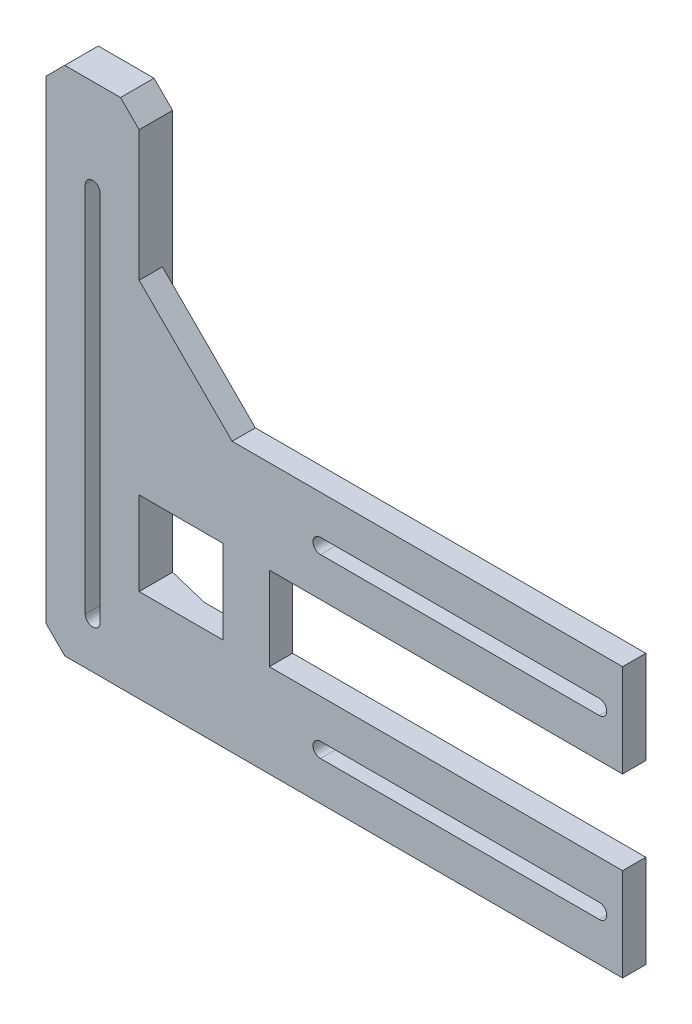
ISO-10303-21;
HEADER;
FILE_DESCRIPTION(('STEP AP214'),'2;1');
FILE_NAME('part.step','',(''),(''),'','','');
FILE_SCHEMA(('AUTOMOTIVE_DESIGN { 1 0 10303 214 1 1 1 1 }'));
ENDSEC;
DATA;
#1=APPLICATION_CONTEXT('core data for automotive mechanical design processes');
#2=APPLICATION_PROTOCOL_DEFINITION('international standard','automotive_design',2000,#1);
#3=PRODUCT_CONTEXT('',#1,'mechanical');
#4=PRODUCT('Part','Part','',(#3));
#5=PRODUCT_RELATED_PRODUCT_CATEGORY('part','',(#4));
#6=PRODUCT_DEFINITION_FORMATION('','',#4);
#7=PRODUCT_DEFINITION_CONTEXT('part definition',#1,'design');
#8=PRODUCT_DEFINITION('design','',#6,#7);
#9=PRODUCT_DEFINITION_SHAPE('','',#8);
#10=(LENGTH_UNIT() NAMED_UNIT(*) SI_UNIT(.MILLI.,.METRE.));
#11=(NAMED_UNIT(*) PLANE_ANGLE_UNIT() SI_UNIT($,.RADIAN.));
#12=(NAMED_UNIT(*) SI_UNIT($,.STERADIAN.) SOLID_ANGLE_UNIT());
#13=UNCERTAINTY_MEASURE_WITH_UNIT(LENGTH_MEASURE(1.E-05),#10,'distance_accuracy_value','');
#14=(GEOMETRIC_REPRESENTATION_CONTEXT(3) GLOBAL_UNCERTAINTY_ASSIGNED_CONTEXT((#13)) GLOBAL_UNIT_ASSIGNED_CONTEXT((#10,
#11,#12)) REPRESENTATION_CONTEXT('',''));
#15=CARTESIAN_POINT('',(0.,0.,0.));
#16=DIRECTION('',(0.,0.,1.));
#17=DIRECTION('',(1.,0.,0.));
#18=AXIS2_PLACEMENT_3D('',#15,#16,#17);
#19=CARTESIAN_POINT('',(0.,22.3644669928919,5.));
#20=DIRECTION('',(0.,-1.,0.));
#21=DIRECTION('',(0.,0.,-1.));
#22=AXIS2_PLACEMENT_3D('',#19,#20,#21);
#23=PLANE('',#22);
#24=DIRECTION('',(-1.,0.,0.));
#25=VECTOR('',#24,1.);
#26=CARTESIAN_POINT('',(0.,22.3644669928919,0.));
#27=LINE('',#26,#25);
#28=CARTESIAN_POINT('',(-66.1345300278278,22.3644669928919,0.));
#29=VERTEX_POINT('',#28);
#30=CARTESIAN_POINT('',(-75.1345300278278,22.3644669928919,0.));
#31=VERTEX_POINT('',#30);
#32=EDGE_CURVE('E483',#29,#31,#27,.T.);
#33=ORIENTED_EDGE('',*,*,#32,.F.);
#34=DIRECTION('',(0.971399006496777,0.,0.23745309047699));
#35=VECTOR('',#34,1.);
#36=CARTESIAN_POINT('',(-75.1345300278278,22.3644669928919,-2.2));
#37=LINE('',#36,#35);
#38=CARTESIAN_POINT('',(-75.1345300278278,22.3644669928919,-2.2));
#39=VERTEX_POINT('',#38);
#40=EDGE_CURVE('E485',#39,#29,#37,.T.);
#41=ORIENTED_EDGE('',*,*,#40,.F.);
#42=DIRECTION('',(0.,0.,-1.));
#43=VECTOR('',#42,1.);
#44=CARTESIAN_POINT('',(-75.1345300278278,22.3644669928919,5.));
#45=LINE('',#44,#43);
#46=EDGE_CURVE('E480',#31,#39,#45,.T.);
#47=ORIENTED_EDGE('',*,*,#46,.F.);
#48=EDGE_LOOP('',(#33,#41,#47));
#49=FACE_BOUND('',#48,.T.);
#50=ADVANCED_FACE('F261',(#49),#23,.F.);
#51=CARTESIAN_POINT('',(-75.1345300278278,0.,5.));
#52=DIRECTION('',(-1.,0.,0.));
#53=DIRECTION('',(0.,0.,1.));
#54=AXIS2_PLACEMENT_3D('',#51,#52,#53);
#55=PLANE('',#54);
#56=DIRECTION('',(0.,0.,-1.));
#57=VECTOR('',#56,1.);
#58=CARTESIAN_POINT('',(-75.1345300278278,-15.6355330071088,5.));
#59=LINE('',#58,#57);
#60=CARTESIAN_POINT('',(-75.1345300278278,-15.6355330071088,5.));
#61=VERTEX_POINT('',#60);
#62=CARTESIAN_POINT('',(-75.1345300278278,-15.6355330071064,-2.2));
#63=VERTEX_POINT('',#62);
#64=EDGE_CURVE('E691',#61,#63,#59,.T.);
#65=ORIENTED_EDGE('',*,*,#64,.T.);
#66=DIRECTION('',(0.,-1.,0.));
#67=VECTOR('',#66,1.);
#68=CARTESIAN_POINT('',(-75.1345300278278,74.406088819695,-2.2));
#69=LINE('',#68,#67);
#70=CARTESIAN_POINT('',(-75.1345300278278,2.36446699289193,-2.2));
#71=VERTEX_POINT('',#70);
#72=EDGE_CURVE('E569',#71,#63,#69,.T.);
#73=ORIENTED_EDGE('',*,*,#72,.F.);
#74=DIRECTION('',(0.,0.,-1.));
#75=VECTOR('',#74,1.);
#76=CARTESIAN_POINT('',(-75.1345300278278,2.36446699289274,5.));
#77=LINE('',#76,#75);
#78=CARTESIAN_POINT('',(-75.1345300278278,2.36446699289274,5.));
#79=VERTEX_POINT('',#78);
#80=EDGE_CURVE('E698',#79,#71,#77,.T.);
#81=ORIENTED_EDGE('',*,*,#80,.F.);
#82=DIRECTION('',(0.,1.,0.));
#83=VECTOR('',#82,1.);
#84=CARTESIAN_POINT('',(-75.1345300278278,0.,5.));
#85=LINE('',#84,#83);
#86=EDGE_CURVE('E660',#61,#79,#85,.T.);
#87=ORIENTED_EDGE('',*,*,#86,.F.);
#88=EDGE_LOOP('',(#65,#73,#81,#87));
#89=FACE_BOUND('',#88,.T.);
#90=ADVANCED_FACE('F772',(#89),#55,.F.);
#91=CARTESIAN_POINT('',(-75.1345300278278,70.406088819695,-2.2));
#92=VERTEX_POINT('',#91);
#93=EDGE_CURVE('E565',#92,#39,#69,.T.);
#94=ORIENTED_EDGE('',*,*,#93,.F.);
#95=DIRECTION('',(0.,0.,1.));
#96=VECTOR('',#95,1.);
#97=CARTESIAN_POINT('',(-75.1345300278278,70.406088819695,5.));
#98=LINE('',#97,#96);
#99=CARTESIAN_POINT('',(-75.1345300278278,70.406088819695,5.));
#100=VERTEX_POINT('',#99);
#101=EDGE_CURVE('E13',#92,#100,#98,.T.);
#102=ORIENTED_EDGE('',*,*,#101,.T.);
#103=DIRECTION('',(0.,1.,0.));
#104=VECTOR('',#103,1.);
#105=CARTESIAN_POINT('',(-75.1345300278278,0.,5.));
#106=LINE('',#105,#104);
#107=CARTESIAN_POINT('',(-75.1345300278278,42.3644669928919,5.));
#108=VERTEX_POINT('',#107);
#109=EDGE_CURVE('E658',#108,#100,#106,.T.);
#110=ORIENTED_EDGE('',*,*,#109,.F.);
#111=DIRECTION('',(0.,0.,1.));
#112=VECTOR('',#111,1.);
#113=CARTESIAN_POINT('',(-75.1345300278278,42.3644669928919,5.));
#114=LINE('',#113,#112);
#115=CARTESIAN_POINT('',(-75.1345300278278,42.3644669928919,0.));
#116=VERTEX_POINT('',#115);
#117=EDGE_CURVE('E496',#108,#116,#114,.F.);
#118=ORIENTED_EDGE('',*,*,#117,.T.);
#119=DIRECTION('',(0.,1.,0.));
#120=VECTOR('',#119,1.);
#121=CARTESIAN_POINT('',(-75.1345300278278,0.,0.));
#122=LINE('',#121,#120);
#123=EDGE_CURVE('E493',#31,#116,#122,.T.);
#124=ORIENTED_EDGE('',*,*,#123,.F.);
#125=ORIENTED_EDGE('',*,*,#46,.T.);
#126=EDGE_LOOP('',(#94,#102,#110,#118,#124,#125));
#127=FACE_BOUND('',#126,.T.);
#128=ADVANCED_FACE('F494',(#127),#55,.F.);
#129=CARTESIAN_POINT('',(0.,0.,0.));
#130=DIRECTION('',(0.,0.,1.));
#131=DIRECTION('',(1.,0.,0.));
#132=AXIS2_PLACEMENT_3D('',#129,#130,#131);
#133=PLANE('',#132);
#134=CARTESIAN_POINT('',(23.8654699721722,-25.6355330071064,0.));
#135=DIRECTION('',(0.,0.,1.));
#136=DIRECTION('',(1.,0.,0.));
#137=AXIS2_PLACEMENT_3D('',#134,#135,#136);
#138=CIRCLE('',#137,1.6);
#139=CARTESIAN_POINT('',(23.8654699721722,-27.2355330071064,0.));
#140=VERTEX_POINT('',#139);
#141=CARTESIAN_POINT('',(23.8654699721722,-24.0355330071064,0.));
#142=VERTEX_POINT('',#141);
#143=EDGE_CURVE('E593',#140,#142,#138,.T.);
#144=ORIENTED_EDGE('',*,*,#143,.T.);
#145=DIRECTION('',(1.,0.,0.));
#146=VECTOR('',#145,1.);
#147=CARTESIAN_POINT('',(-36.1345300278278,-24.0355330071064,0.));
#148=LINE('',#147,#146);
#149=CARTESIAN_POINT('',(-36.1345300278278,-24.0355330071064,0.));
#150=VERTEX_POINT('',#149);
#151=EDGE_CURVE('E576',#150,#142,#148,.T.);
#152=ORIENTED_EDGE('',*,*,#151,.F.);
#153=CARTESIAN_POINT('',(-36.1345300278278,-25.6355330071064,0.));
#154=DIRECTION('',(0.,0.,1.));
#155=DIRECTION('',(1.,0.,0.));
#156=AXIS2_PLACEMENT_3D('',#153,#154,#155);
#157=CIRCLE('',#156,1.6);
#158=CARTESIAN_POINT('',(-36.1345300278278,-27.2355330071064,0.));
#159=VERTEX_POINT('',#158);
#160=EDGE_CURVE('E583',#150,#159,#157,.T.);
#161=ORIENTED_EDGE('',*,*,#160,.T.);
#162=DIRECTION('',(1.,0.,0.));
#163=VECTOR('',#162,1.);
#164=CARTESIAN_POINT('',(-36.1345300278278,-27.2355330071064,0.));
#165=LINE('',#164,#163);
#166=EDGE_CURVE('E574',#159,#140,#165,.T.);
#167=ORIENTED_EDGE('',*,*,#166,.T.);
#168=EDGE_LOOP('',(#144,#152,#161,#167));
#169=FACE_BOUND('',#168,.T.);
#170=DIRECTION('',(0.,-1.,0.));
#171=VECTOR('',#170,1.);
#172=CARTESIAN_POINT('',(-66.1345300278278,0.,0.));
#173=LINE('',#172,#171);
#174=CARTESIAN_POINT('',(-66.1345300278278,2.36446699289193,0.));
#175=VERTEX_POINT('',#174);
#176=EDGE_CURVE('E506',#175,#29,#173,.F.);
#177=ORIENTED_EDGE('',*,*,#176,.T.);
#178=ORIENTED_EDGE('',*,*,#32,.T.);
#179=ORIENTED_EDGE('',*,*,#123,.T.);
#180=DIRECTION('',(0.707106781186548,-0.707106781186548,0.));
#181=VECTOR('',#180,1.);
#182=CARTESIAN_POINT('',(-75.1345300278278,42.3644669928919,0.));
#183=LINE('',#182,#181);
#184=CARTESIAN_POINT('',(-55.1345300278278,22.3644669928919,0.));
#185=VERTEX_POINT('',#184);
#186=EDGE_CURVE('E510',#116,#185,#183,.T.);
#187=ORIENTED_EDGE('',*,*,#186,.T.);
#188=DIRECTION('',(-1.,0.,0.));
#189=VECTOR('',#188,1.);
#190=CARTESIAN_POINT('',(0.,22.3644669928919,0.));
#191=LINE('',#190,#189);
#192=CARTESIAN_POINT('',(28.8654699721715,22.3644669928919,0.));
#193=VERTEX_POINT('',#192);
#194=EDGE_CURVE('E682',#193,#185,#191,.T.);
#195=ORIENTED_EDGE('',*,*,#194,.F.);
#196=DIRECTION('',(0.,-1.,0.));
#197=VECTOR('',#196,1.);
#198=CARTESIAN_POINT('',(28.8654699721715,0.,0.));
#199=LINE('',#198,#197);
#200=CARTESIAN_POINT('',(28.8654699721715,2.36446699289274,0.));
#201=VERTEX_POINT('',#200);
#202=EDGE_CURVE('E679',#193,#201,#199,.T.);
#203=ORIENTED_EDGE('',*,*,#202,.T.);
#204=DIRECTION('',(-1.,0.,0.));
#205=VECTOR('',#204,1.);
#206=CARTESIAN_POINT('',(0.,2.36446699289274,0.));
#207=LINE('',#206,#205);
#208=CARTESIAN_POINT('',(-47.1345300278284,2.36446699289274,0.));
#209=VERTEX_POINT('',#208);
#210=EDGE_CURVE('E677',#201,#209,#207,.T.);
#211=ORIENTED_EDGE('',*,*,#210,.T.);
#212=DIRECTION('',(0.,1.,0.));
#213=VECTOR('',#212,1.);
#214=CARTESIAN_POINT('',(-47.1345300278284,0.,0.));
#215=LINE('',#214,#213);
#216=CARTESIAN_POINT('',(-47.1345300278284,-15.6355330071088,0.));
#217=VERTEX_POINT('',#216);
#218=EDGE_CURVE('E674',#217,#209,#215,.T.);
#219=ORIENTED_EDGE('',*,*,#218,.F.);
#220=DIRECTION('',(-1.,0.,0.));
#221=VECTOR('',#220,1.);
#222=CARTESIAN_POINT('',(0.,-15.6355330071088,0.));
#223=LINE('',#222,#221);
#224=CARTESIAN_POINT('',(28.8654699721722,-15.6355330071088,0.));
#225=VERTEX_POINT('',#224);
#226=EDGE_CURVE('E672',#225,#217,#223,.T.);
#227=ORIENTED_EDGE('',*,*,#226,.F.);
#228=DIRECTION('',(0.,1.,0.));
#229=VECTOR('',#228,1.);
#230=CARTESIAN_POINT('',(28.8654699721722,0.,0.));
#231=LINE('',#230,#229);
#232=CARTESIAN_POINT('',(28.8654699721722,-35.6355330071064,0.));
#233=VERTEX_POINT('',#232);
#234=EDGE_CURVE('E670',#233,#225,#231,.T.);
#235=ORIENTED_EDGE('',*,*,#234,.F.);
#236=DIRECTION('',(-1.,0.,0.));
#237=VECTOR('',#236,1.);
#238=CARTESIAN_POINT('',(0.,-35.6355330071064,0.));
#239=LINE('',#238,#237);
#240=CARTESIAN_POINT('',(-66.1345300278274,-35.6355330071064,1.02782365951626E-13));
#241=VERTEX_POINT('',#240);
#242=EDGE_CURVE('E633',#233,#241,#239,.T.);
#243=ORIENTED_EDGE('',*,*,#242,.T.);
#244=DIRECTION('',(0.,1.,0.));
#245=VECTOR('',#244,1.);
#246=CARTESIAN_POINT('',(-66.1345300278278,0.,0.));
#247=LINE('',#246,#245);
#248=CARTESIAN_POINT('',(-66.1345300278274,-15.6355330071064,1.02782365951626E-13));
#249=VERTEX_POINT('',#248);
#250=EDGE_CURVE('E525',#241,#249,#247,.T.);
#251=ORIENTED_EDGE('',*,*,#250,.T.);
#252=DIRECTION('',(-1.,0.,0.));
#253=VECTOR('',#252,1.);
#254=CARTESIAN_POINT('',(0.,-15.6355330071088,0.));
#255=LINE('',#254,#253);
#256=CARTESIAN_POINT('',(-57.1345300278278,-15.6355330071088,0.));
#257=VERTEX_POINT('',#256);
#258=EDGE_CURVE('E637',#257,#249,#255,.T.);
#259=ORIENTED_EDGE('',*,*,#258,.F.);
#260=DIRECTION('',(0.,1.,0.));
#261=VECTOR('',#260,1.);
#262=CARTESIAN_POINT('',(-57.1345300278278,0.,0.));
#263=LINE('',#262,#261);
#264=CARTESIAN_POINT('',(-57.1345300278278,2.36446699289274,0.));
#265=VERTEX_POINT('',#264);
#266=EDGE_CURVE('E686',#257,#265,#263,.T.);
#267=ORIENTED_EDGE('',*,*,#266,.T.);
#268=DIRECTION('',(-1.,0.,0.));
#269=VECTOR('',#268,1.);
#270=CARTESIAN_POINT('',(0.,2.36446699289274,0.));
#271=LINE('',#270,#269);
#272=EDGE_CURVE('E684',#265,#175,#271,.T.);
#273=ORIENTED_EDGE('',*,*,#272,.T.);
#274=EDGE_LOOP('',(#177,#178,#179,#187,#195,#203,#211,#219,#227,#235,#243,#251,#259,#267,#273));
#275=FACE_BOUND('',#274,.T.);
#276=CARTESIAN_POINT('',(-36.1345300278285,12.3644669928919,0.));
#277=DIRECTION('',(0.,0.,1.));
#278=DIRECTION('',(1.,0.,0.));
#279=AXIS2_PLACEMENT_3D('',#276,#277,#278);
#280=CIRCLE('',#279,1.6);
#281=CARTESIAN_POINT('',(-36.1345300278285,13.9644669928919,0.));
#282=VERTEX_POINT('',#281);
#283=CARTESIAN_POINT('',(-36.1345300278285,10.7644669928919,0.));
#284=VERTEX_POINT('',#283);
#285=EDGE_CURVE('E614',#282,#284,#280,.T.);
#286=ORIENTED_EDGE('',*,*,#285,.T.);
#287=DIRECTION('',(1.,0.,0.));
#288=VECTOR('',#287,1.);
#289=CARTESIAN_POINT('',(-36.1345300278285,10.7644669928919,0.));
#290=LINE('',#289,#288);
#291=CARTESIAN_POINT('',(23.8654699721715,10.7644669928919,0.));
#292=VERTEX_POINT('',#291);
#293=EDGE_CURVE('E604',#284,#292,#290,.T.);
#294=ORIENTED_EDGE('',*,*,#293,.T.);
#295=CARTESIAN_POINT('',(23.8654699721715,12.3644669928919,0.));
#296=DIRECTION('',(0.,0.,1.));
#297=DIRECTION('',(1.,0.,0.));
#298=AXIS2_PLACEMENT_3D('',#295,#296,#297);
#299=CIRCLE('',#298,1.6);
#300=CARTESIAN_POINT('',(23.8654699721715,13.9644669928919,0.));
#301=VERTEX_POINT('',#300);
#302=EDGE_CURVE('E625',#292,#301,#299,.T.);
#303=ORIENTED_EDGE('',*,*,#302,.T.);
#304=DIRECTION('',(1.,0.,0.));
#305=VECTOR('',#304,1.);
#306=CARTESIAN_POINT('',(-36.1345300278285,13.9644669928919,0.));
#307=LINE('',#306,#305);
#308=EDGE_CURVE('E607',#282,#301,#307,.T.);
#309=ORIENTED_EDGE('',*,*,#308,.F.);
#310=EDGE_LOOP('',(#286,#294,#303,#309));
#311=FACE_BOUND('',#310,.T.);
#312=ADVANCED_FACE('F503',(#169,#275,#311),#133,.F.);
#313=CARTESIAN_POINT('',(0.,0.,5.));
#314=DIRECTION('',(0.,0.,1.));
#315=DIRECTION('',(1.,0.,0.));
#316=AXIS2_PLACEMENT_3D('',#313,#314,#315);
#317=PLANE('',#316);
#318=DIRECTION('',(0.,1.,0.));
#319=VECTOR('',#318,1.);
#320=CARTESIAN_POINT('',(-95.1345300278278,0.,5.));
#321=LINE('',#320,#319);
#322=CARTESIAN_POINT('',(-95.1345300278278,-31.6355330071064,5.));
#323=VERTEX_POINT('',#322);
#324=CARTESIAN_POINT('',(-95.1345300278278,70.406088819695,5.));
#325=VERTEX_POINT('',#324);
#326=EDGE_CURVE('E636',#323,#325,#321,.T.);
#327=ORIENTED_EDGE('',*,*,#326,.F.);
#328=DIRECTION('',(-0.707106781186545,0.70710678118655,0.));
#329=VECTOR('',#328,1.);
#330=CARTESIAN_POINT('',(-63.3850315174674,-63.385031517467,5.));
#331=LINE('',#330,#329);
#332=CARTESIAN_POINT('',(-91.1345300278278,-35.6355330071064,5.));
#333=VERTEX_POINT('',#332);
#334=EDGE_CURVE('E730',#323,#333,#331,.F.);
#335=ORIENTED_EDGE('',*,*,#334,.T.);
#336=DIRECTION('',(-1.,0.,0.));
#337=VECTOR('',#336,1.);
#338=CARTESIAN_POINT('',(0.,-35.6355330071064,5.));
#339=LINE('',#338,#337);
#340=CARTESIAN_POINT('',(28.8654699721722,-35.6355330071064,5.));
#341=VERTEX_POINT('',#340);
#342=EDGE_CURVE('E640',#341,#333,#339,.T.);
#343=ORIENTED_EDGE('',*,*,#342,.F.);
#344=DIRECTION('',(0.,1.,0.));
#345=VECTOR('',#344,1.);
#346=CARTESIAN_POINT('',(28.8654699721722,0.,5.));
#347=LINE('',#346,#345);
#348=CARTESIAN_POINT('',(28.8654699721722,-15.6355330071088,5.));
#349=VERTEX_POINT('',#348);
#350=EDGE_CURVE('E643',#341,#349,#347,.T.);
#351=ORIENTED_EDGE('',*,*,#350,.T.);
#352=DIRECTION('',(-1.,0.,0.));
#353=VECTOR('',#352,1.);
#354=CARTESIAN_POINT('',(0.,-15.6355330071088,5.));
#355=LINE('',#354,#353);
#356=CARTESIAN_POINT('',(-47.1345300278284,-15.6355330071088,5.));
#357=VERTEX_POINT('',#356);
#358=EDGE_CURVE('E645',#349,#357,#355,.T.);
#359=ORIENTED_EDGE('',*,*,#358,.T.);
#360=DIRECTION('',(0.,1.,0.));
#361=VECTOR('',#360,1.);
#362=CARTESIAN_POINT('',(-47.1345300278284,0.,5.));
#363=LINE('',#362,#361);
#364=CARTESIAN_POINT('',(-47.1345300278284,2.36446699289274,5.));
#365=VERTEX_POINT('',#364);
#366=EDGE_CURVE('E647',#357,#365,#363,.T.);
#367=ORIENTED_EDGE('',*,*,#366,.T.);
#368=DIRECTION('',(-1.,0.,0.));
#369=VECTOR('',#368,1.);
#370=CARTESIAN_POINT('',(0.,2.36446699289274,5.));
#371=LINE('',#370,#369);
#372=CARTESIAN_POINT('',(28.8654699721715,2.36446699289274,5.));
#373=VERTEX_POINT('',#372);
#374=EDGE_CURVE('E650',#373,#365,#371,.T.);
#375=ORIENTED_EDGE('',*,*,#374,.F.);
#376=DIRECTION('',(0.,-1.,0.));
#377=VECTOR('',#376,1.);
#378=CARTESIAN_POINT('',(28.8654699721715,0.,5.));
#379=LINE('',#378,#377);
#380=CARTESIAN_POINT('',(28.8654699721715,22.3644669928919,5.));
#381=VERTEX_POINT('',#380);
#382=EDGE_CURVE('E652',#381,#373,#379,.T.);
#383=ORIENTED_EDGE('',*,*,#382,.F.);
#384=DIRECTION('',(-1.,0.,0.));
#385=VECTOR('',#384,1.);
#386=CARTESIAN_POINT('',(0.,22.3644669928919,5.));
#387=LINE('',#386,#385);
#388=CARTESIAN_POINT('',(-55.1345300278278,22.3644669928919,5.));
#389=VERTEX_POINT('',#388);
#390=EDGE_CURVE('E655',#381,#389,#387,.T.);
#391=ORIENTED_EDGE('',*,*,#390,.T.);
#392=DIRECTION('',(0.707106781186548,-0.707106781186548,0.));
#393=VECTOR('',#392,1.);
#394=CARTESIAN_POINT('',(-75.1345300278278,42.3644669928919,5.));
#395=LINE('',#394,#393);
#396=EDGE_CURVE('E507',#108,#389,#395,.T.);
#397=ORIENTED_EDGE('',*,*,#396,.F.);
#398=ORIENTED_EDGE('',*,*,#109,.T.);
#399=DIRECTION('',(-0.707106781186545,0.70710678118655,0.));
#400=VECTOR('',#399,1.);
#401=CARTESIAN_POINT('',(-2.36422060406667,-2.36422060406666,5.));
#402=LINE('',#401,#400);
#403=CARTESIAN_POINT('',(-79.1345300278278,74.406088819695,5.));
#404=VERTEX_POINT('',#403);
#405=EDGE_CURVE('E277',#100,#404,#402,.T.);
#406=ORIENTED_EDGE('',*,*,#405,.T.);
#407=DIRECTION('',(1.,0.,0.));
#408=VECTOR('',#407,1.);
#409=CARTESIAN_POINT('',(0.,74.406088819695,5.));
#410=LINE('',#409,#408);
#411=CARTESIAN_POINT('',(-91.1345300278278,74.406088819695,5.));
#412=VERTEX_POINT('',#411);
#413=EDGE_CURVE('E634',#412,#404,#410,.T.);
#414=ORIENTED_EDGE('',*,*,#413,.F.);
#415=DIRECTION('',(0.70710678118655,0.707106781186545,0.));
#416=VECTOR('',#415,1.);
#417=CARTESIAN_POINT('',(-82.7703094237611,82.7703094237616,5.));
#418=LINE('',#417,#416);
#419=EDGE_CURVE('E728',#412,#325,#418,.F.);
#420=ORIENTED_EDGE('',*,*,#419,.T.);
#421=EDGE_LOOP('',(#327,#335,#343,#351,#359,#367,#375,#383,#391,#397,#398,#406,#414,#420));
#422=FACE_BOUND('',#421,.T.);
#423=DIRECTION('',(0.,1.,0.));
#424=VECTOR('',#423,1.);
#425=CARTESIAN_POINT('',(-86.7345300278278,-25.6355330071064,5.));
#426=LINE('',#425,#424);
#427=CARTESIAN_POINT('',(-86.7345300278278,-25.6355330071064,5.));
#428=VERTEX_POINT('',#427);
#429=CARTESIAN_POINT('',(-86.7345300278278,54.3644669928936,5.));
#430=VERTEX_POINT('',#429);
#431=EDGE_CURVE('E535',#428,#430,#426,.T.);
#432=ORIENTED_EDGE('',*,*,#431,.T.);
#433=CARTESIAN_POINT('',(-85.1345300278278,54.3644669928936,5.));
#434=DIRECTION('',(0.,0.,1.));
#435=DIRECTION('',(1.,0.,0.));
#436=AXIS2_PLACEMENT_3D('',#433,#434,#435);
#437=CIRCLE('',#436,1.59999999999999);
#438=CARTESIAN_POINT('',(-83.5345300278278,54.3644669928936,5.));
#439=VERTEX_POINT('',#438);
#440=EDGE_CURVE('E549',#439,#430,#437,.T.);
#441=ORIENTED_EDGE('',*,*,#440,.F.);
#442=DIRECTION('',(0.,1.,0.));
#443=VECTOR('',#442,1.);
#444=CARTESIAN_POINT('',(-83.5345300278277,-25.6355330071064,5.));
#445=LINE('',#444,#443);
#446=CARTESIAN_POINT('',(-83.5345300278278,-25.6355330071064,5.));
#447=VERTEX_POINT('',#446);
#448=EDGE_CURVE('E529',#447,#439,#445,.T.);
#449=ORIENTED_EDGE('',*,*,#448,.F.);
#450=CARTESIAN_POINT('',(-85.1345300278278,-25.6355330071064,5.));
#451=DIRECTION('',(0.,0.,1.));
#452=DIRECTION('',(1.,0.,0.));
#453=AXIS2_PLACEMENT_3D('',#450,#451,#452);
#454=CIRCLE('',#453,1.59999999999999);
#455=EDGE_CURVE('E539',#428,#447,#454,.T.);
#456=ORIENTED_EDGE('',*,*,#455,.F.);
#457=EDGE_LOOP('',(#432,#441,#449,#456));
#458=FACE_BOUND('',#457,.T.);
#459=DIRECTION('',(1.,0.,0.));
#460=VECTOR('',#459,1.);
#461=CARTESIAN_POINT('',(-36.1345300278278,-24.0355330071064,5.));
#462=LINE('',#461,#460);
#463=CARTESIAN_POINT('',(-36.1345300278278,-24.0355330071064,5.));
#464=VERTEX_POINT('',#463);
#465=CARTESIAN_POINT('',(23.8654699721722,-24.0355330071064,5.));
#466=VERTEX_POINT('',#465);
#467=EDGE_CURVE('E578',#464,#466,#462,.T.);
#468=ORIENTED_EDGE('',*,*,#467,.T.);
#469=CARTESIAN_POINT('',(23.8654699721722,-25.6355330071064,5.));
#470=DIRECTION('',(0.,0.,1.));
#471=DIRECTION('',(1.,0.,0.));
#472=AXIS2_PLACEMENT_3D('',#469,#470,#471);
#473=CIRCLE('',#472,1.59999999999999);
#474=CARTESIAN_POINT('',(23.8654699721722,-27.2355330071064,5.));
#475=VERTEX_POINT('',#474);
#476=EDGE_CURVE('E590',#475,#466,#473,.T.);
#477=ORIENTED_EDGE('',*,*,#476,.F.);
#478=DIRECTION('',(1.,0.,0.));
#479=VECTOR('',#478,1.);
#480=CARTESIAN_POINT('',(-36.1345300278278,-27.2355330071064,5.));
#481=LINE('',#480,#479);
#482=CARTESIAN_POINT('',(-36.1345300278278,-27.2355330071064,5.));
#483=VERTEX_POINT('',#482);
#484=EDGE_CURVE('E572',#483,#475,#481,.T.);
#485=ORIENTED_EDGE('',*,*,#484,.F.);
#486=CARTESIAN_POINT('',(-36.1345300278278,-25.6355330071064,5.));
#487=DIRECTION('',(0.,0.,1.));
#488=DIRECTION('',(1.,0.,0.));
#489=AXIS2_PLACEMENT_3D('',#486,#487,#488);
#490=CIRCLE('',#489,1.59999999999999);
#491=EDGE_CURVE('E580',#464,#483,#490,.T.);
#492=ORIENTED_EDGE('',*,*,#491,.F.);
#493=EDGE_LOOP('',(#468,#477,#485,#492));
#494=FACE_BOUND('',#493,.T.);
#495=DIRECTION('',(-1.,0.,0.));
#496=VECTOR('',#495,1.);
#497=CARTESIAN_POINT('',(0.,2.36446699289274,5.));
#498=LINE('',#497,#496);
#499=CARTESIAN_POINT('',(-57.1345300278278,2.36446699289274,5.));
#500=VERTEX_POINT('',#499);
#501=EDGE_CURVE('E662',#500,#79,#498,.T.);
#502=ORIENTED_EDGE('',*,*,#501,.F.);
#503=DIRECTION('',(0.,1.,0.));
#504=VECTOR('',#503,1.);
#505=CARTESIAN_POINT('',(-57.1345300278278,0.,5.));
#506=LINE('',#505,#504);
#507=CARTESIAN_POINT('',(-57.1345300278278,-15.6355330071088,5.));
#508=VERTEX_POINT('',#507);
#509=EDGE_CURVE('E665',#508,#500,#506,.T.);
#510=ORIENTED_EDGE('',*,*,#509,.F.);
#511=DIRECTION('',(-1.,0.,0.));
#512=VECTOR('',#511,1.);
#513=CARTESIAN_POINT('',(0.,-15.6355330071088,5.));
#514=LINE('',#513,#512);
#515=EDGE_CURVE('E490',#508,#61,#514,.T.);
#516=ORIENTED_EDGE('',*,*,#515,.T.);
#517=ORIENTED_EDGE('',*,*,#86,.T.);
#518=EDGE_LOOP('',(#502,#510,#516,#517));
#519=FACE_BOUND('',#518,.T.);
#520=CARTESIAN_POINT('',(-36.1345300278285,12.3644669928919,5.));
#521=DIRECTION('',(0.,0.,1.));
#522=DIRECTION('',(1.,0.,0.));
#523=AXIS2_PLACEMENT_3D('',#520,#521,#522);
#524=CIRCLE('',#523,1.59999999999999);
#525=CARTESIAN_POINT('',(-36.1345300278285,13.9644669928919,5.));
#526=VERTEX_POINT('',#525);
#527=CARTESIAN_POINT('',(-36.1345300278285,10.7644669928919,5.));
#528=VERTEX_POINT('',#527);
#529=EDGE_CURVE('E612',#526,#528,#524,.T.);
#530=ORIENTED_EDGE('',*,*,#529,.F.);
#531=DIRECTION('',(1.,0.,0.));
#532=VECTOR('',#531,1.);
#533=CARTESIAN_POINT('',(-36.1345300278285,13.9644669928919,5.));
#534=LINE('',#533,#532);
#535=CARTESIAN_POINT('',(23.8654699721715,13.9644669928919,5.));
#536=VERTEX_POINT('',#535);
#537=EDGE_CURVE('E609',#526,#536,#534,.T.);
#538=ORIENTED_EDGE('',*,*,#537,.T.);
#539=CARTESIAN_POINT('',(23.8654699721715,12.3644669928919,5.));
#540=DIRECTION('',(0.,0.,1.));
#541=DIRECTION('',(1.,0.,0.));
#542=AXIS2_PLACEMENT_3D('',#539,#540,#541);
#543=CIRCLE('',#542,1.59999999999999);
#544=CARTESIAN_POINT('',(23.8654699721715,10.7644669928919,5.));
#545=VERTEX_POINT('',#544);
#546=EDGE_CURVE('E622',#545,#536,#543,.T.);
#547=ORIENTED_EDGE('',*,*,#546,.F.);
#548=DIRECTION('',(1.,0.,0.));
#549=VECTOR('',#548,1.);
#550=CARTESIAN_POINT('',(-36.1345300278285,10.7644669928919,5.));
#551=LINE('',#550,#549);
#552=EDGE_CURVE('E602',#528,#545,#551,.T.);
#553=ORIENTED_EDGE('',*,*,#552,.F.);
#554=EDGE_LOOP('',(#530,#538,#547,#553));
#555=FACE_BOUND('',#554,.T.);
#556=ADVANCED_FACE('F749',(#422,#458,#494,#519,#555),#317,.T.);
#557=CARTESIAN_POINT('',(0.,2.36446699289274,5.));
#558=DIRECTION('',(0.,-1.,0.));
#559=DIRECTION('',(0.,0.,-1.));
#560=AXIS2_PLACEMENT_3D('',#557,#558,#559);
#561=PLANE('',#560);
#562=ORIENTED_EDGE('',*,*,#80,.T.);
#563=DIRECTION('',(0.971399006496777,0.,0.23745309047699));
#564=VECTOR('',#563,1.);
#565=CARTESIAN_POINT('',(-75.1345300278278,2.36446699289193,-2.2));
#566=LINE('',#565,#564);
#567=EDGE_CURVE('E516',#71,#175,#566,.T.);
#568=ORIENTED_EDGE('',*,*,#567,.T.);
#569=ORIENTED_EDGE('',*,*,#272,.F.);
#570=DIRECTION('',(0.,0.,-1.));
#571=VECTOR('',#570,1.);
#572=CARTESIAN_POINT('',(-57.1345300278278,2.36446699289274,5.));
#573=LINE('',#572,#571);
#574=EDGE_CURVE('E696',#500,#265,#573,.T.);
#575=ORIENTED_EDGE('',*,*,#574,.F.);
#576=ORIENTED_EDGE('',*,*,#501,.T.);
#577=EDGE_LOOP('',(#562,#568,#569,#575,#576));
#578=FACE_BOUND('',#577,.T.);
#579=ADVANCED_FACE('F926',(#578),#561,.T.);
#580=CARTESIAN_POINT('',(-57.1345300278278,0.,5.));
#581=DIRECTION('',(-1.,0.,0.));
#582=DIRECTION('',(0.,0.,1.));
#583=AXIS2_PLACEMENT_3D('',#580,#581,#582);
#584=PLANE('',#583);
#585=ORIENTED_EDGE('',*,*,#266,.F.);
#586=DIRECTION('',(0.,0.,-1.));
#587=VECTOR('',#586,1.);
#588=CARTESIAN_POINT('',(-57.1345300278278,-15.6355330071088,5.));
#589=LINE('',#588,#587);
#590=EDGE_CURVE('E693',#508,#257,#589,.T.);
#591=ORIENTED_EDGE('',*,*,#590,.F.);
#592=ORIENTED_EDGE('',*,*,#509,.T.);
#593=ORIENTED_EDGE('',*,*,#574,.T.);
#594=EDGE_LOOP('',(#585,#591,#592,#593));
#595=FACE_BOUND('',#594,.T.);
#596=ADVANCED_FACE('F853',(#595),#584,.T.);
#597=CARTESIAN_POINT('',(0.,74.406088819695,5.));
#598=DIRECTION('',(0.,1.,0.));
#599=DIRECTION('',(0.,0.,1.));
#600=AXIS2_PLACEMENT_3D('',#597,#598,#599);
#601=PLANE('',#600);
#602=DIRECTION('',(1.,0.,0.));
#603=VECTOR('',#602,1.);
#604=CARTESIAN_POINT('',(-95.1345300278278,74.406088819695,-2.2));
#605=LINE('',#604,#603);
#606=CARTESIAN_POINT('',(-91.1345300278278,74.406088819695,-2.2));
#607=VERTEX_POINT('',#606);
#608=CARTESIAN_POINT('',(-79.1345300278278,74.406088819695,-2.2));
#609=VERTEX_POINT('',#608);
#610=EDGE_CURVE('E561',#607,#609,#605,.T.);
#611=ORIENTED_EDGE('',*,*,#610,.F.);
#612=DIRECTION('',(0.,0.,1.));
#613=VECTOR('',#612,1.);
#614=CARTESIAN_POINT('',(-91.1345300278278,74.406088819695,5.));
#615=LINE('',#614,#613);
#616=EDGE_CURVE('E270',#607,#412,#615,.T.);
#617=ORIENTED_EDGE('',*,*,#616,.T.);
#618=ORIENTED_EDGE('',*,*,#413,.T.);
#619=DIRECTION('',(0.,0.,-1.));
#620=VECTOR('',#619,1.);
#621=CARTESIAN_POINT('',(-79.1345300278278,74.406088819695,-2.2));
#622=LINE('',#621,#620);
#623=EDGE_CURVE('E732',#404,#609,#622,.T.);
#624=ORIENTED_EDGE('',*,*,#623,.T.);
#625=EDGE_LOOP('',(#611,#617,#618,#624));
#626=FACE_BOUND('',#625,.T.);
#627=ADVANCED_FACE('F735',(#626),#601,.T.);
#628=CARTESIAN_POINT('',(-95.1345300278278,0.,5.));
#629=DIRECTION('',(-1.,0.,0.));
#630=DIRECTION('',(0.,0.,1.));
#631=AXIS2_PLACEMENT_3D('',#628,#629,#630);
#632=PLANE('',#631);
#633=DIRECTION('',(0.,1.,0.));
#634=VECTOR('',#633,1.);
#635=CARTESIAN_POINT('',(-95.1345300278278,74.406088819695,-2.2));
#636=LINE('',#635,#634);
#637=CARTESIAN_POINT('',(-95.1345300278278,-31.6355330071064,-2.2));
#638=VERTEX_POINT('',#637);
#639=CARTESIAN_POINT('',(-95.1345300278278,70.406088819695,-2.2));
#640=VERTEX_POINT('',#639);
#641=EDGE_CURVE('E558',#638,#640,#636,.T.);
#642=ORIENTED_EDGE('',*,*,#641,.F.);
#643=DIRECTION('',(0.,0.,1.));
#644=VECTOR('',#643,1.);
#645=CARTESIAN_POINT('',(-95.1345300278278,-31.6355330071064,5.));
#646=LINE('',#645,#644);
#647=EDGE_CURVE('E725',#638,#323,#646,.T.);
#648=ORIENTED_EDGE('',*,*,#647,.T.);
#649=ORIENTED_EDGE('',*,*,#326,.T.);
#650=DIRECTION('',(0.,0.,-1.));
#651=VECTOR('',#650,1.);
#652=CARTESIAN_POINT('',(-95.1345300278278,70.406088819695,5.));
#653=LINE('',#652,#651);
#654=EDGE_CURVE('E722',#325,#640,#653,.T.);
#655=ORIENTED_EDGE('',*,*,#654,.T.);
#656=EDGE_LOOP('',(#642,#648,#649,#655));
#657=FACE_BOUND('',#656,.T.);
#658=ADVANCED_FACE('F745',(#657),#632,.T.);
#659=CARTESIAN_POINT('',(0.,-35.6355330071064,5.));
#660=DIRECTION('',(0.,-1.,0.));
#661=DIRECTION('',(0.,0.,-1.));
#662=AXIS2_PLACEMENT_3D('',#659,#660,#661);
#663=PLANE('',#662);
#664=ORIENTED_EDGE('',*,*,#342,.T.);
#665=DIRECTION('',(0.,0.,-1.));
#666=VECTOR('',#665,1.);
#667=CARTESIAN_POINT('',(-91.1345300278278,-35.6355330071064,5.));
#668=LINE('',#667,#666);
#669=CARTESIAN_POINT('',(-91.1345300278278,-35.6355330071072,-2.2));
#670=VERTEX_POINT('',#669);
#671=EDGE_CURVE('E699',#333,#670,#668,.T.);
#672=ORIENTED_EDGE('',*,*,#671,.T.);
#673=DIRECTION('',(-1.,0.,0.));
#674=VECTOR('',#673,1.);
#675=CARTESIAN_POINT('',(-95.1345300278278,-35.6355330071072,-2.2));
#676=LINE('',#675,#674);
#677=CARTESIAN_POINT('',(-75.1345300278278,-35.6355330071072,-2.2));
#678=VERTEX_POINT('',#677);
#679=EDGE_CURVE('E567',#678,#670,#676,.T.);
#680=ORIENTED_EDGE('',*,*,#679,.F.);
#681=DIRECTION('',(0.971399006496778,0.,0.23745309047699));
#682=VECTOR('',#681,1.);
#683=CARTESIAN_POINT('',(-75.1345300278278,-35.6355330071064,-2.2));
#684=LINE('',#683,#682);
#685=EDGE_CURVE('E522',#678,#241,#684,.T.);
#686=ORIENTED_EDGE('',*,*,#685,.T.);
#687=ORIENTED_EDGE('',*,*,#242,.F.);
#688=DIRECTION('',(0.,0.,-1.));
#689=VECTOR('',#688,1.);
#690=CARTESIAN_POINT('',(28.8654699721722,-35.6355330071064,5.));
#691=LINE('',#690,#689);
#692=EDGE_CURVE('E694',#341,#233,#691,.T.);
#693=ORIENTED_EDGE('',*,*,#692,.F.);
#694=EDGE_LOOP('',(#664,#672,#680,#686,#687,#693));
#695=FACE_BOUND('',#694,.T.);
#696=ADVANCED_FACE('F757',(#695),#663,.T.);
#697=CARTESIAN_POINT('',(28.8654699721722,0.,5.));
#698=DIRECTION('',(-1.,0.,0.));
#699=DIRECTION('',(0.,0.,1.));
#700=AXIS2_PLACEMENT_3D('',#697,#698,#699);
#701=PLANE('',#700);
#702=ORIENTED_EDGE('',*,*,#234,.T.);
#703=DIRECTION('',(0.,0.,-1.));
#704=VECTOR('',#703,1.);
#705=CARTESIAN_POINT('',(28.8654699721722,-15.6355330071088,5.));
#706=LINE('',#705,#704);
#707=EDGE_CURVE('E710',#349,#225,#706,.T.);
#708=ORIENTED_EDGE('',*,*,#707,.F.);
#709=ORIENTED_EDGE('',*,*,#350,.F.);
#710=ORIENTED_EDGE('',*,*,#692,.T.);
#711=EDGE_LOOP('',(#702,#708,#709,#710));
#712=FACE_BOUND('',#711,.T.);
#713=ADVANCED_FACE('F789',(#712),#701,.F.);
#714=CARTESIAN_POINT('',(0.,-15.6355330071088,5.));
#715=DIRECTION('',(0.,-1.,0.));
#716=DIRECTION('',(0.,0.,-1.));
#717=AXIS2_PLACEMENT_3D('',#714,#715,#716);
#718=PLANE('',#717);
#719=ORIENTED_EDGE('',*,*,#226,.T.);
#720=DIRECTION('',(0.,0.,-1.));
#721=VECTOR('',#720,1.);
#722=CARTESIAN_POINT('',(-47.1345300278284,-15.6355330071088,5.));
#723=LINE('',#722,#721);
#724=EDGE_CURVE('E707',#357,#217,#723,.T.);
#725=ORIENTED_EDGE('',*,*,#724,.F.);
#726=ORIENTED_EDGE('',*,*,#358,.F.);
#727=ORIENTED_EDGE('',*,*,#707,.T.);
#728=EDGE_LOOP('',(#719,#725,#726,#727));
#729=FACE_BOUND('',#728,.T.);
#730=ADVANCED_FACE('F796',(#729),#718,.F.);
#731=CARTESIAN_POINT('',(-47.1345300278284,0.,5.));
#732=DIRECTION('',(-1.,0.,0.));
#733=DIRECTION('',(0.,0.,1.));
#734=AXIS2_PLACEMENT_3D('',#731,#732,#733);
#735=PLANE('',#734);
#736=ORIENTED_EDGE('',*,*,#218,.T.);
#737=DIRECTION('',(0.,0.,-1.));
#738=VECTOR('',#737,1.);
#739=CARTESIAN_POINT('',(-47.1345300278284,2.36446699289274,5.));
#740=LINE('',#739,#738);
#741=EDGE_CURVE('E704',#365,#209,#740,.T.);
#742=ORIENTED_EDGE('',*,*,#741,.F.);
#743=ORIENTED_EDGE('',*,*,#366,.F.);
#744=ORIENTED_EDGE('',*,*,#724,.T.);
#745=EDGE_LOOP('',(#736,#742,#743,#744));
#746=FACE_BOUND('',#745,.T.);
#747=ADVANCED_FACE('F799',(#746),#735,.F.);
#748=CARTESIAN_POINT('',(0.,2.36446699289274,5.));
#749=DIRECTION('',(0.,-1.,0.));
#750=DIRECTION('',(0.,0.,-1.));
#751=AXIS2_PLACEMENT_3D('',#748,#749,#750);
#752=PLANE('',#751);
#753=ORIENTED_EDGE('',*,*,#374,.T.);
#754=ORIENTED_EDGE('',*,*,#741,.T.);
#755=ORIENTED_EDGE('',*,*,#210,.F.);
#756=DIRECTION('',(0.,0.,-1.));
#757=VECTOR('',#756,1.);
#758=CARTESIAN_POINT('',(28.8654699721715,2.36446699289274,5.));
#759=LINE('',#758,#757);
#760=EDGE_CURVE('E702',#373,#201,#759,.T.);
#761=ORIENTED_EDGE('',*,*,#760,.F.);
#762=EDGE_LOOP('',(#753,#754,#755,#761));
#763=FACE_BOUND('',#762,.T.);
#764=ADVANCED_FACE('F802',(#763),#752,.T.);
#765=CARTESIAN_POINT('',(28.8654699721715,0.,5.));
#766=DIRECTION('',(1.,0.,0.));
#767=DIRECTION('',(0.,0.,-1.));
#768=AXIS2_PLACEMENT_3D('',#765,#766,#767);
#769=PLANE('',#768);
#770=ORIENTED_EDGE('',*,*,#202,.F.);
#771=DIRECTION('',(0.,0.,-1.));
#772=VECTOR('',#771,1.);
#773=CARTESIAN_POINT('',(28.8654699721715,22.3644669928919,5.));
#774=LINE('',#773,#772);
#775=EDGE_CURVE('E489',#381,#193,#774,.T.);
#776=ORIENTED_EDGE('',*,*,#775,.F.);
#777=ORIENTED_EDGE('',*,*,#382,.T.);
#778=ORIENTED_EDGE('',*,*,#760,.T.);
#779=EDGE_LOOP('',(#770,#776,#777,#778));
#780=FACE_BOUND('',#779,.T.);
#781=ADVANCED_FACE('F806',(#780),#769,.T.);
#782=ORIENTED_EDGE('',*,*,#194,.T.);
#783=DIRECTION('',(0.,0.,-1.));
#784=VECTOR('',#783,1.);
#785=CARTESIAN_POINT('',(-55.1345300278278,22.3644669928919,5.));
#786=LINE('',#785,#784);
#787=EDGE_CURVE('E500',#185,#389,#786,.F.);
#788=ORIENTED_EDGE('',*,*,#787,.T.);
#789=ORIENTED_EDGE('',*,*,#390,.F.);
#790=ORIENTED_EDGE('',*,*,#775,.T.);
#791=EDGE_LOOP('',(#782,#788,#789,#790));
#792=FACE_BOUND('',#791,.T.);
#793=ADVANCED_FACE('F810',(#792),#23,.F.);
#794=CARTESIAN_POINT('',(0.,-15.6355330071088,5.));
#795=DIRECTION('',(0.,-1.,0.));
#796=DIRECTION('',(0.,0.,-1.));
#797=AXIS2_PLACEMENT_3D('',#794,#795,#796);
#798=PLANE('',#797);
#799=ORIENTED_EDGE('',*,*,#258,.T.);
#800=DIRECTION('',(0.971399006496778,0.,0.23745309047699));
#801=VECTOR('',#800,1.);
#802=CARTESIAN_POINT('',(-75.1345300278278,-15.6355330071064,-2.2));
#803=LINE('',#802,#801);
#804=EDGE_CURVE('E521',#63,#249,#803,.T.);
#805=ORIENTED_EDGE('',*,*,#804,.F.);
#806=ORIENTED_EDGE('',*,*,#64,.F.);
#807=ORIENTED_EDGE('',*,*,#515,.F.);
#808=ORIENTED_EDGE('',*,*,#590,.T.);
#809=EDGE_LOOP('',(#799,#805,#806,#807,#808));
#810=FACE_BOUND('',#809,.T.);
#811=ADVANCED_FACE('F777',(#810),#798,.F.);
#812=CARTESIAN_POINT('',(23.8654699721715,12.3644669928919,5.));
#813=DIRECTION('',(0.,0.,1.));
#814=DIRECTION('',(1.,0.,0.));
#815=AXIS2_PLACEMENT_3D('',#812,#813,#814);
#816=CYLINDRICAL_SURFACE('',#815,1.59999999999999);
#817=ORIENTED_EDGE('',*,*,#302,.F.);
#818=DIRECTION('',(0.,0.,1.));
#819=VECTOR('',#818,1.);
#820=CARTESIAN_POINT('',(23.8654699721715,10.764466992892,5.));
#821=LINE('',#820,#819);
#822=EDGE_CURVE('E630',#545,#292,#821,.F.);
#823=ORIENTED_EDGE('',*,*,#822,.F.);
#824=ORIENTED_EDGE('',*,*,#546,.T.);
#825=DIRECTION('',(0.,0.,1.));
#826=VECTOR('',#825,1.);
#827=CARTESIAN_POINT('',(23.8654699721715,13.9644669928919,5.));
#828=LINE('',#827,#826);
#829=EDGE_CURVE('E628',#301,#536,#828,.T.);
#830=ORIENTED_EDGE('',*,*,#829,.F.);
#831=EDGE_LOOP('',(#817,#823,#824,#830));
#832=FACE_BOUND('',#831,.T.);
#833=ADVANCED_FACE('F835',(#832),#816,.F.);
#834=CARTESIAN_POINT('',(-36.1345300278285,12.3644669928919,5.));
#835=DIRECTION('',(0.,0.,1.));
#836=DIRECTION('',(1.,0.,0.));
#837=AXIS2_PLACEMENT_3D('',#834,#835,#836);
#838=CYLINDRICAL_SURFACE('',#837,1.59999999999999);
#839=ORIENTED_EDGE('',*,*,#529,.T.);
#840=DIRECTION('',(0.,0.,1.));
#841=VECTOR('',#840,1.);
#842=CARTESIAN_POINT('',(-36.1345300278285,10.7644669928919,5.));
#843=LINE('',#842,#841);
#844=EDGE_CURVE('E617',#284,#528,#843,.T.);
#845=ORIENTED_EDGE('',*,*,#844,.F.);
#846=ORIENTED_EDGE('',*,*,#285,.F.);
#847=DIRECTION('',(0.,0.,1.));
#848=VECTOR('',#847,1.);
#849=CARTESIAN_POINT('',(-36.1345300278285,13.9644669928919,5.));
#850=LINE('',#849,#848);
#851=EDGE_CURVE('E620',#526,#282,#850,.F.);
#852=ORIENTED_EDGE('',*,*,#851,.F.);
#853=EDGE_LOOP('',(#839,#845,#846,#852));
#854=FACE_BOUND('',#853,.T.);
#855=ADVANCED_FACE('F1120',(#854),#838,.F.);
#856=CARTESIAN_POINT('',(-36.1345300278285,13.9644669928919,5.));
#857=DIRECTION('',(0.,1.,0.));
#858=DIRECTION('',(-1.,0.,0.));
#859=AXIS2_PLACEMENT_3D('',#856,#857,#858);
#860=PLANE('',#859);
#861=ORIENTED_EDGE('',*,*,#829,.T.);
#862=ORIENTED_EDGE('',*,*,#537,.F.);
#863=ORIENTED_EDGE('',*,*,#851,.T.);
#864=ORIENTED_EDGE('',*,*,#308,.T.);
#865=EDGE_LOOP('',(#861,#862,#863,#864));
#866=FACE_BOUND('',#865,.T.);
#867=ADVANCED_FACE('F1110',(#866),#860,.F.);
#868=CARTESIAN_POINT('',(-36.1345300278285,10.7644669928919,5.));
#869=DIRECTION('',(0.,-1.,0.));
#870=DIRECTION('',(1.,0.,0.));
#871=AXIS2_PLACEMENT_3D('',#868,#869,#870);
#872=PLANE('',#871);
#873=ORIENTED_EDGE('',*,*,#822,.T.);
#874=ORIENTED_EDGE('',*,*,#293,.F.);
#875=ORIENTED_EDGE('',*,*,#844,.T.);
#876=ORIENTED_EDGE('',*,*,#552,.T.);
#877=EDGE_LOOP('',(#873,#874,#875,#876));
#878=FACE_BOUND('',#877,.T.);
#879=ADVANCED_FACE('F1100',(#878),#872,.F.);
#880=CARTESIAN_POINT('',(23.8654699721722,-25.6355330071064,5.));
#881=DIRECTION('',(0.,0.,1.));
#882=DIRECTION('',(1.,0.,0.));
#883=AXIS2_PLACEMENT_3D('',#880,#881,#882);
#884=CYLINDRICAL_SURFACE('',#883,1.59999999999999);
#885=ORIENTED_EDGE('',*,*,#143,.F.);
#886=DIRECTION('',(0.,0.,1.));
#887=VECTOR('',#886,1.);
#888=CARTESIAN_POINT('',(23.8654699721722,-27.2355330071064,5.));
#889=LINE('',#888,#887);
#890=EDGE_CURVE('E599',#475,#140,#889,.F.);
#891=ORIENTED_EDGE('',*,*,#890,.F.);
#892=ORIENTED_EDGE('',*,*,#476,.T.);
#893=DIRECTION('',(0.,0.,1.));
#894=VECTOR('',#893,1.);
#895=CARTESIAN_POINT('',(23.8654699721722,-24.0355330071064,5.));
#896=LINE('',#895,#894);
#897=EDGE_CURVE('E596',#142,#466,#896,.T.);
#898=ORIENTED_EDGE('',*,*,#897,.F.);
#899=EDGE_LOOP('',(#885,#891,#892,#898));
#900=FACE_BOUND('',#899,.T.);
#901=ADVANCED_FACE('F1090',(#900),#884,.F.);
#902=CARTESIAN_POINT('',(-36.1345300278278,-25.6355330071064,5.));
#903=DIRECTION('',(0.,0.,1.));
#904=DIRECTION('',(1.,0.,0.));
#905=AXIS2_PLACEMENT_3D('',#902,#903,#904);
#906=CYLINDRICAL_SURFACE('',#905,1.59999999999999);
#907=ORIENTED_EDGE('',*,*,#491,.T.);
#908=DIRECTION('',(0.,0.,1.));
#909=VECTOR('',#908,1.);
#910=CARTESIAN_POINT('',(-36.1345300278278,-27.2355330071064,5.));
#911=LINE('',#910,#909);
#912=EDGE_CURVE('E586',#159,#483,#911,.T.);
#913=ORIENTED_EDGE('',*,*,#912,.F.);
#914=ORIENTED_EDGE('',*,*,#160,.F.);
#915=DIRECTION('',(0.,0.,1.));
#916=VECTOR('',#915,1.);
#917=CARTESIAN_POINT('',(-36.1345300278278,-24.0355330071064,5.));
#918=LINE('',#917,#916);
#919=EDGE_CURVE('E588',#464,#150,#918,.F.);
#920=ORIENTED_EDGE('',*,*,#919,.F.);
#921=EDGE_LOOP('',(#907,#913,#914,#920));
#922=FACE_BOUND('',#921,.T.);
#923=ADVANCED_FACE('F999',(#922),#906,.F.);
#924=CARTESIAN_POINT('',(-36.1345300278278,-24.0355330071064,5.));
#925=DIRECTION('',(0.,1.,0.));
#926=DIRECTION('',(-1.,0.,0.));
#927=AXIS2_PLACEMENT_3D('',#924,#925,#926);
#928=PLANE('',#927);
#929=ORIENTED_EDGE('',*,*,#897,.T.);
#930=ORIENTED_EDGE('',*,*,#467,.F.);
#931=ORIENTED_EDGE('',*,*,#919,.T.);
#932=ORIENTED_EDGE('',*,*,#151,.T.);
#933=EDGE_LOOP('',(#929,#930,#931,#932));
#934=FACE_BOUND('',#933,.T.);
#935=ADVANCED_FACE('F988',(#934),#928,.F.);
#936=CARTESIAN_POINT('',(-36.1345300278278,-27.2355330071064,5.));
#937=DIRECTION('',(0.,-1.,0.));
#938=DIRECTION('',(1.,0.,0.));
#939=AXIS2_PLACEMENT_3D('',#936,#937,#938);
#940=PLANE('',#939);
#941=ORIENTED_EDGE('',*,*,#890,.T.);
#942=ORIENTED_EDGE('',*,*,#166,.F.);
#943=ORIENTED_EDGE('',*,*,#912,.T.);
#944=ORIENTED_EDGE('',*,*,#484,.T.);
#945=EDGE_LOOP('',(#941,#942,#943,#944));
#946=FACE_BOUND('',#945,.T.);
#947=ADVANCED_FACE('F888',(#946),#940,.F.);
#948=CARTESIAN_POINT('',(0.,0.,-2.2));
#949=DIRECTION('',(0.,0.,1.));
#950=DIRECTION('',(1.,0.,0.));
#951=AXIS2_PLACEMENT_3D('',#948,#949,#950);
#952=PLANE('',#951);
#953=DIRECTION('',(0.,1.,0.));
#954=VECTOR('',#953,1.);
#955=CARTESIAN_POINT('',(-83.5345300278278,-25.6355330071064,-2.2));
#956=LINE('',#955,#954);
#957=CARTESIAN_POINT('',(-83.5345300278278,-25.6355330071064,-2.2));
#958=VERTEX_POINT('',#957);
#959=CARTESIAN_POINT('',(-83.5345300278278,54.3644669928936,-2.2));
#960=VERTEX_POINT('',#959);
#961=EDGE_CURVE('E531',#958,#960,#956,.T.);
#962=ORIENTED_EDGE('',*,*,#961,.T.);
#963=CARTESIAN_POINT('',(-85.1345300278278,54.3644669928936,-2.2));
#964=DIRECTION('',(0.,0.,1.));
#965=DIRECTION('',(1.,0.,0.));
#966=AXIS2_PLACEMENT_3D('',#963,#964,#965);
#967=CIRCLE('',#966,1.6);
#968=CARTESIAN_POINT('',(-86.7345300278278,54.3644669928936,-2.2));
#969=VERTEX_POINT('',#968);
#970=EDGE_CURVE('E552',#960,#969,#967,.T.);
#971=ORIENTED_EDGE('',*,*,#970,.T.);
#972=DIRECTION('',(0.,1.,0.));
#973=VECTOR('',#972,1.);
#974=CARTESIAN_POINT('',(-86.7345300278278,-25.6355330071064,-2.2));
#975=LINE('',#974,#973);
#976=CARTESIAN_POINT('',(-86.7345300278278,-25.6355330071064,-2.2));
#977=VERTEX_POINT('',#976);
#978=EDGE_CURVE('E533',#977,#969,#975,.T.);
#979=ORIENTED_EDGE('',*,*,#978,.F.);
#980=CARTESIAN_POINT('',(-85.1345300278278,-25.6355330071064,-2.2));
#981=DIRECTION('',(0.,0.,1.));
#982=DIRECTION('',(1.,0.,0.));
#983=AXIS2_PLACEMENT_3D('',#980,#981,#982);
#984=CIRCLE('',#983,1.6);
#985=EDGE_CURVE('E541',#977,#958,#984,.T.);
#986=ORIENTED_EDGE('',*,*,#985,.T.);
#987=EDGE_LOOP('',(#962,#971,#979,#986));
#988=FACE_BOUND('',#987,.T.);
#989=ORIENTED_EDGE('',*,*,#679,.T.);
#990=DIRECTION('',(0.707106781186545,-0.70710678118655,0.));
#991=VECTOR('',#990,1.);
#992=CARTESIAN_POINT('',(-91.1345300278278,-35.6355330071064,-2.2));
#993=LINE('',#992,#991);
#994=EDGE_CURVE('E720',#670,#638,#993,.F.);
#995=ORIENTED_EDGE('',*,*,#994,.T.);
#996=ORIENTED_EDGE('',*,*,#641,.T.);
#997=DIRECTION('',(-0.70710678118655,-0.707106781186545,0.));
#998=VECTOR('',#997,1.);
#999=CARTESIAN_POINT('',(-95.1345300278278,70.406088819695,-2.2));
#1000=LINE('',#999,#998);
#1001=EDGE_CURVE('E718',#640,#607,#1000,.F.);
#1002=ORIENTED_EDGE('',*,*,#1001,.T.);
#1003=ORIENTED_EDGE('',*,*,#610,.T.);
#1004=DIRECTION('',(0.707106781186545,-0.70710678118655,0.));
#1005=VECTOR('',#1004,1.);
#1006=CARTESIAN_POINT('',(-79.1345300278278,74.406088819695,-2.2));
#1007=LINE('',#1006,#1005);
#1008=EDGE_CURVE('E716',#609,#92,#1007,.T.);
#1009=ORIENTED_EDGE('',*,*,#1008,.T.);
#1010=ORIENTED_EDGE('',*,*,#93,.T.);
#1011=EDGE_CURVE('E568',#39,#71,#69,.T.);
#1012=ORIENTED_EDGE('',*,*,#1011,.T.);
#1013=ORIENTED_EDGE('',*,*,#72,.T.);
#1014=EDGE_CURVE('E564',#63,#678,#69,.T.);
#1015=ORIENTED_EDGE('',*,*,#1014,.T.);
#1016=EDGE_LOOP('',(#989,#995,#996,#1002,#1003,#1009,#1010,#1012,#1013,#1015));
#1017=FACE_BOUND('',#1016,.T.);
#1018=ADVANCED_FACE('F738',(#988,#1017),#952,.F.);
#1019=CARTESIAN_POINT('',(-85.1345300278278,54.3644669928936,5.));
#1020=DIRECTION('',(0.,0.,1.));
#1021=DIRECTION('',(1.,0.,0.));
#1022=AXIS2_PLACEMENT_3D('',#1019,#1020,#1021);
#1023=CYLINDRICAL_SURFACE('',#1022,1.6);
#1024=ORIENTED_EDGE('',*,*,#970,.F.);
#1025=DIRECTION('',(0.,0.,-1.));
#1026=VECTOR('',#1025,1.);
#1027=CARTESIAN_POINT('',(-83.5345300278278,54.3644669928936,-2.2));
#1028=LINE('',#1027,#1026);
#1029=EDGE_CURVE('E546',#439,#960,#1028,.T.);
#1030=ORIENTED_EDGE('',*,*,#1029,.F.);
#1031=ORIENTED_EDGE('',*,*,#440,.T.);
#1032=DIRECTION('',(0.,0.,1.));
#1033=VECTOR('',#1032,1.);
#1034=CARTESIAN_POINT('',(-86.7345300278278,54.3644669928936,5.));
#1035=LINE('',#1034,#1033);
#1036=EDGE_CURVE('E555',#969,#430,#1035,.T.);
#1037=ORIENTED_EDGE('',*,*,#1036,.F.);
#1038=EDGE_LOOP('',(#1024,#1030,#1031,#1037));
#1039=FACE_BOUND('',#1038,.T.);
#1040=ADVANCED_FACE('F887',(#1039),#1023,.F.);
#1041=CARTESIAN_POINT('',(-85.1345300278278,-25.6355330071064,5.));
#1042=DIRECTION('',(0.,0.,1.));
#1043=DIRECTION('',(1.,0.,0.));
#1044=AXIS2_PLACEMENT_3D('',#1041,#1042,#1043);
#1045=CYLINDRICAL_SURFACE('',#1044,1.6);
#1046=DIRECTION('',(0.,0.,-1.));
#1047=VECTOR('',#1046,1.);
#1048=CARTESIAN_POINT('',(-83.5345300278278,-25.6355330071064,-2.2));
#1049=LINE('',#1048,#1047);
#1050=EDGE_CURVE('E537',#447,#958,#1049,.T.);
#1051=ORIENTED_EDGE('',*,*,#1050,.T.);
#1052=ORIENTED_EDGE('',*,*,#985,.F.);
#1053=DIRECTION('',(0.,0.,1.));
#1054=VECTOR('',#1053,1.);
#1055=CARTESIAN_POINT('',(-86.7345300278278,-25.6355330071064,5.));
#1056=LINE('',#1055,#1054);
#1057=EDGE_CURVE('E544',#428,#977,#1056,.F.);
#1058=ORIENTED_EDGE('',*,*,#1057,.F.);
#1059=ORIENTED_EDGE('',*,*,#455,.T.);
#1060=EDGE_LOOP('',(#1051,#1052,#1058,#1059));
#1061=FACE_BOUND('',#1060,.T.);
#1062=ADVANCED_FACE('F970',(#1061),#1045,.F.);
#1063=CARTESIAN_POINT('',(-86.7345300278278,-25.6355330071064,5.));
#1064=DIRECTION('',(-1.,0.,0.));
#1065=DIRECTION('',(0.,-1.,0.));
#1066=AXIS2_PLACEMENT_3D('',#1063,#1064,#1065);
#1067=PLANE('',#1066);
#1068=ORIENTED_EDGE('',*,*,#1036,.T.);
#1069=ORIENTED_EDGE('',*,*,#431,.F.);
#1070=ORIENTED_EDGE('',*,*,#1057,.T.);
#1071=ORIENTED_EDGE('',*,*,#978,.T.);
#1072=EDGE_LOOP('',(#1068,#1069,#1070,#1071));
#1073=FACE_BOUND('',#1072,.T.);
#1074=ADVANCED_FACE('F959',(#1073),#1067,.F.);
#1075=CARTESIAN_POINT('',(-83.5345300278278,-25.6355330071064,-2.2));
#1076=DIRECTION('',(1.,0.,0.));
#1077=DIRECTION('',(0.,0.,-1.));
#1078=AXIS2_PLACEMENT_3D('',#1075,#1076,#1077);
#1079=PLANE('',#1078);
#1080=ORIENTED_EDGE('',*,*,#448,.T.);
#1081=ORIENTED_EDGE('',*,*,#1029,.T.);
#1082=ORIENTED_EDGE('',*,*,#961,.F.);
#1083=ORIENTED_EDGE('',*,*,#1050,.F.);
#1084=EDGE_LOOP('',(#1080,#1081,#1082,#1083));
#1085=FACE_BOUND('',#1084,.T.);
#1086=ADVANCED_FACE('F954',(#1085),#1079,.F.);
#1087=CARTESIAN_POINT('',(-75.1345300278278,-35.6355330071064,-2.2));
#1088=DIRECTION('',(0.23745309047699,0.,-0.971399006496778));
#1089=DIRECTION('',(0.971399006496778,0.,0.23745309047699));
#1090=AXIS2_PLACEMENT_3D('',#1087,#1088,#1089);
#1091=PLANE('',#1090);
#1092=ORIENTED_EDGE('',*,*,#250,.F.);
#1093=ORIENTED_EDGE('',*,*,#685,.F.);
#1094=ORIENTED_EDGE('',*,*,#1014,.F.);
#1095=ORIENTED_EDGE('',*,*,#804,.T.);
#1096=EDGE_LOOP('',(#1092,#1093,#1094,#1095));
#1097=FACE_BOUND('',#1096,.T.);
#1098=ADVANCED_FACE('F781',(#1097),#1091,.T.);
#1099=CARTESIAN_POINT('',(-75.1345300278278,22.3644669928919,-2.2));
#1100=DIRECTION('',(-0.23745309047699,0.,0.971399006496777));
#1101=DIRECTION('',(0.971399006496777,0.,0.23745309047699));
#1102=AXIS2_PLACEMENT_3D('',#1099,#1100,#1101);
#1103=PLANE('',#1102);
#1104=ORIENTED_EDGE('',*,*,#176,.F.);
#1105=ORIENTED_EDGE('',*,*,#567,.F.);
#1106=ORIENTED_EDGE('',*,*,#1011,.F.);
#1107=ORIENTED_EDGE('',*,*,#40,.T.);
#1108=EDGE_LOOP('',(#1104,#1105,#1106,#1107));
#1109=FACE_BOUND('',#1108,.T.);
#1110=ADVANCED_FACE('F767',(#1109),#1103,.F.);
#1111=CARTESIAN_POINT('',(-75.1345300278278,42.3644669928919,5.));
#1112=DIRECTION('',(-0.707106781186548,-0.707106781186548,0.));
#1113=DIRECTION('',(0.707106781186548,-0.707106781186548,0.));
#1114=AXIS2_PLACEMENT_3D('',#1111,#1112,#1113);
#1115=PLANE('',#1114);
#1116=ORIENTED_EDGE('',*,*,#117,.F.);
#1117=ORIENTED_EDGE('',*,*,#396,.T.);
#1118=ORIENTED_EDGE('',*,*,#787,.F.);
#1119=ORIENTED_EDGE('',*,*,#186,.F.);
#1120=EDGE_LOOP('',(#1116,#1117,#1118,#1119));
#1121=FACE_BOUND('',#1120,.T.);
#1122=ADVANCED_FACE('F814',(#1121),#1115,.F.);
#1123=CARTESIAN_POINT('',(-91.1345300278278,-35.6355330071064,5.));
#1124=DIRECTION('',(0.70710678118655,0.707106781186545,0.));
#1125=DIRECTION('',(0.,0.,-1.));
#1126=AXIS2_PLACEMENT_3D('',#1123,#1124,#1125);
#1127=PLANE('',#1126);
#1128=ORIENTED_EDGE('',*,*,#334,.F.);
#1129=ORIENTED_EDGE('',*,*,#647,.F.);
#1130=ORIENTED_EDGE('',*,*,#994,.F.);
#1131=ORIENTED_EDGE('',*,*,#671,.F.);
#1132=EDGE_LOOP('',(#1128,#1129,#1130,#1131));
#1133=FACE_BOUND('',#1132,.T.);
#1134=ADVANCED_FACE('F754',(#1133),#1127,.F.);
#1135=CARTESIAN_POINT('',(-95.1345300278278,70.406088819695,5.));
#1136=DIRECTION('',(0.707106781186545,-0.70710678118655,0.));
#1137=DIRECTION('',(0.,0.,-1.));
#1138=AXIS2_PLACEMENT_3D('',#1135,#1136,#1137);
#1139=PLANE('',#1138);
#1140=ORIENTED_EDGE('',*,*,#419,.F.);
#1141=ORIENTED_EDGE('',*,*,#616,.F.);
#1142=ORIENTED_EDGE('',*,*,#1001,.F.);
#1143=ORIENTED_EDGE('',*,*,#654,.F.);
#1144=EDGE_LOOP('',(#1140,#1141,#1142,#1143));
#1145=FACE_BOUND('',#1144,.T.);
#1146=ADVANCED_FACE('F743',(#1145),#1139,.F.);
#1147=CARTESIAN_POINT('',(-79.1345300278278,74.406088819695,5.));
#1148=DIRECTION('',(0.70710678118655,0.707106781186545,0.));
#1149=DIRECTION('',(0.,0.,1.));
#1150=AXIS2_PLACEMENT_3D('',#1147,#1148,#1149);
#1151=PLANE('',#1150);
#1152=ORIENTED_EDGE('',*,*,#405,.F.);
#1153=ORIENTED_EDGE('',*,*,#101,.F.);
#1154=ORIENTED_EDGE('',*,*,#1008,.F.);
#1155=ORIENTED_EDGE('',*,*,#623,.F.);
#1156=EDGE_LOOP('',(#1152,#1153,#1154,#1155));
#1157=FACE_BOUND('',#1156,.T.);
#1158=ADVANCED_FACE('F264',(#1157),#1151,.T.);
#1159=CLOSED_SHELL('',(#50,#90,#128,#312,#556,#579,#596,#627,#658,#696,#713,#730,#747,#764,#781,
#793,#811,#833,#855,#867,#879,#901,#923,#935,#947,#1018,#1040,#1062,#1074,#1086,#1098,#1110,
#1122,#1134,#1146,#1158));
#1160=MANIFOLD_SOLID_BREP('B2',#1159);
#1161=ADVANCED_BREP_SHAPE_REPRESENTATION('',(#18,#1160),#14);
#1162=SHAPE_DEFINITION_REPRESENTATION(#9,#1161);
ENDSEC;
END-ISO-10303-21;
